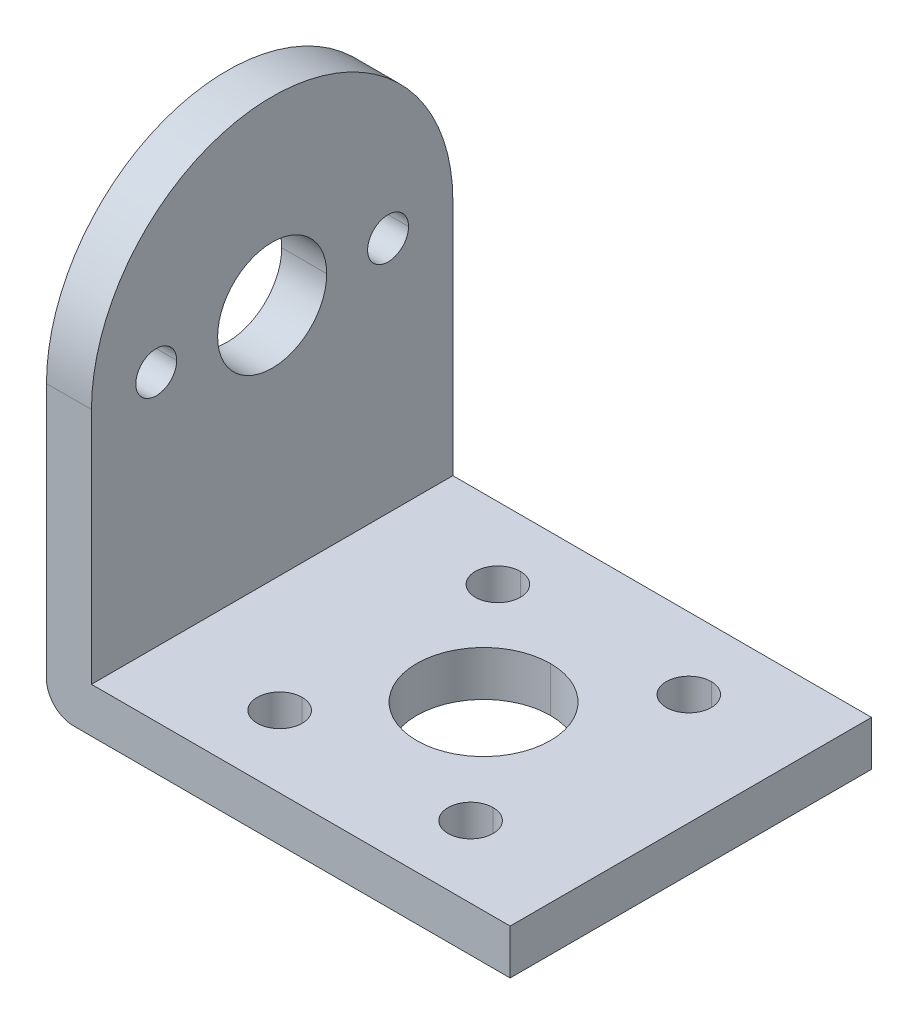
ISO-10303-21;
HEADER;
FILE_DESCRIPTION(('STEP AP214'),'2;1');
FILE_NAME('part.step','',(''),(''),'','','');
FILE_SCHEMA(('AUTOMOTIVE_DESIGN { 1 0 10303 214 1 1 1 1 }'));
ENDSEC;
DATA;
#1=APPLICATION_CONTEXT('core data for automotive mechanical design processes');
#2=APPLICATION_PROTOCOL_DEFINITION('international standard','automotive_design',2000,#1);
#3=PRODUCT_CONTEXT('',#1,'mechanical');
#4=PRODUCT('Part','Part','',(#3));
#5=PRODUCT_RELATED_PRODUCT_CATEGORY('part','',(#4));
#6=PRODUCT_DEFINITION_FORMATION('','',#4);
#7=PRODUCT_DEFINITION_CONTEXT('part definition',#1,'design');
#8=PRODUCT_DEFINITION('design','',#6,#7);
#9=PRODUCT_DEFINITION_SHAPE('','',#8);
#10=(LENGTH_UNIT() NAMED_UNIT(*) SI_UNIT(.MILLI.,.METRE.));
#11=(NAMED_UNIT(*) PLANE_ANGLE_UNIT() SI_UNIT($,.RADIAN.));
#12=(NAMED_UNIT(*) SI_UNIT($,.STERADIAN.) SOLID_ANGLE_UNIT());
#13=UNCERTAINTY_MEASURE_WITH_UNIT(LENGTH_MEASURE(1.E-05),#10,'distance_accuracy_value','');
#14=(GEOMETRIC_REPRESENTATION_CONTEXT(3) GLOBAL_UNCERTAINTY_ASSIGNED_CONTEXT((#13)) GLOBAL_UNIT_ASSIGNED_CONTEXT((#10,
#11,#12)) REPRESENTATION_CONTEXT('',''));
#15=CARTESIAN_POINT('',(0.,0.,0.));
#16=DIRECTION('',(0.,0.,1.));
#17=DIRECTION('',(1.,0.,0.));
#18=AXIS2_PLACEMENT_3D('',#15,#16,#17);
#19=CARTESIAN_POINT('',(0.,0.,-8.5));
#20=DIRECTION('',(-1.,0.,0.));
#21=DIRECTION('',(0.,0.,1.));
#22=AXIS2_PLACEMENT_3D('',#19,#20,#21);
#23=CONICAL_SURFACE('',#22,2.5,0.785398163397443);
#24=DIRECTION('',(-0.707106781186551,0.,-0.707106781186545));
#25=VECTOR('',#24,1.);
#26=CARTESIAN_POINT('',(0.,0.,-11.));
#27=LINE('',#26,#25);
#28=CARTESIAN_POINT('',(1.,0.,-10.));
#29=VERTEX_POINT('',#28);
#30=CARTESIAN_POINT('',(0.,0.,-11.));
#31=VERTEX_POINT('',#30);
#32=EDGE_CURVE('E522',#29,#31,#27,.T.);
#33=ORIENTED_EDGE('',*,*,#32,.F.);
#34=CARTESIAN_POINT('',(1.,0.,-8.5));
#35=DIRECTION('',(-1.,0.,0.));
#36=DIRECTION('',(0.,0.,-1.));
#37=AXIS2_PLACEMENT_3D('',#34,#35,#36);
#38=CIRCLE('',#37,1.5);
#39=CARTESIAN_POINT('',(1.,0.,-7.));
#40=VERTEX_POINT('',#39);
#41=EDGE_CURVE('E310',#40,#29,#38,.T.);
#42=ORIENTED_EDGE('',*,*,#41,.F.);
#43=DIRECTION('',(-0.707106781186551,0.,0.707106781186545));
#44=VECTOR('',#43,1.);
#45=CARTESIAN_POINT('',(0.,0.,-6.));
#46=LINE('',#45,#44);
#47=CARTESIAN_POINT('',(0.,0.,-6.));
#48=VERTEX_POINT('',#47);
#49=EDGE_CURVE('E535',#40,#48,#46,.T.);
#50=ORIENTED_EDGE('',*,*,#49,.T.);
#51=CARTESIAN_POINT('',(0.,0.,-8.5));
#52=DIRECTION('',(1.,0.,0.));
#53=DIRECTION('',(0.,0.,-1.));
#54=AXIS2_PLACEMENT_3D('',#51,#52,#53);
#55=CIRCLE('',#54,2.5);
#56=EDGE_CURVE('E284',#31,#48,#55,.T.);
#57=ORIENTED_EDGE('',*,*,#56,.F.);
#58=EDGE_LOOP('',(#33,#42,#50,#57));
#59=FACE_BOUND('',#58,.T.);
#60=ADVANCED_FACE('F15',(#59),#23,.F.);
#61=CARTESIAN_POINT('',(0.,0.,8.5));
#62=DIRECTION('',(-1.,0.,0.));
#63=DIRECTION('',(0.,0.,1.));
#64=AXIS2_PLACEMENT_3D('',#61,#62,#63);
#65=CONICAL_SURFACE('',#64,2.5,0.785398163397443);
#66=DIRECTION('',(-0.707106781186551,0.,-0.707106781186544));
#67=VECTOR('',#66,1.);
#68=CARTESIAN_POINT('',(0.,0.,6.));
#69=LINE('',#68,#67);
#70=CARTESIAN_POINT('',(1.,0.,7.));
#71=VERTEX_POINT('',#70);
#72=CARTESIAN_POINT('',(0.,0.,6.));
#73=VERTEX_POINT('',#72);
#74=EDGE_CURVE('E545',#71,#73,#69,.T.);
#75=ORIENTED_EDGE('',*,*,#74,.F.);
#76=CARTESIAN_POINT('',(1.,0.,8.5));
#77=DIRECTION('',(-1.,0.,0.));
#78=DIRECTION('',(0.,0.,-1.));
#79=AXIS2_PLACEMENT_3D('',#76,#77,#78);
#80=CIRCLE('',#79,1.5);
#81=CARTESIAN_POINT('',(1.,0.,10.));
#82=VERTEX_POINT('',#81);
#83=EDGE_CURVE('E307',#82,#71,#80,.T.);
#84=ORIENTED_EDGE('',*,*,#83,.F.);
#85=DIRECTION('',(-0.707106781186551,0.,0.707106781186544));
#86=VECTOR('',#85,1.);
#87=CARTESIAN_POINT('',(0.,0.,11.));
#88=LINE('',#87,#86);
#89=CARTESIAN_POINT('',(0.,0.,11.));
#90=VERTEX_POINT('',#89);
#91=EDGE_CURVE('E277',#82,#90,#88,.T.);
#92=ORIENTED_EDGE('',*,*,#91,.T.);
#93=CARTESIAN_POINT('',(0.,0.,8.5));
#94=DIRECTION('',(1.,0.,0.));
#95=DIRECTION('',(0.,0.,-1.));
#96=AXIS2_PLACEMENT_3D('',#93,#94,#95);
#97=CIRCLE('',#96,2.5);
#98=EDGE_CURVE('E288',#73,#90,#97,.T.);
#99=ORIENTED_EDGE('',*,*,#98,.F.);
#100=EDGE_LOOP('',(#75,#84,#92,#99));
#101=FACE_BOUND('',#100,.T.);
#102=ADVANCED_FACE('F513',(#101),#65,.F.);
#103=CARTESIAN_POINT('',(25.85,-17.45,-8.));
#104=DIRECTION('',(0.,-1.,0.));
#105=DIRECTION('',(0.,0.,-1.));
#106=AXIS2_PLACEMENT_3D('',#103,#104,#105);
#107=CYLINDRICAL_SURFACE('',#106,1.65);
#108=DIRECTION('',(0.,-1.,0.));
#109=VECTOR('',#108,1.);
#110=CARTESIAN_POINT('',(25.85,-17.45,-6.35));
#111=LINE('',#110,#109);
#112=CARTESIAN_POINT('',(25.85,-17.45,-6.35));
#113=VERTEX_POINT('',#112);
#114=CARTESIAN_POINT('',(25.85,-20.75,-6.35));
#115=VERTEX_POINT('',#114);
#116=EDGE_CURVE('E265',#113,#115,#111,.T.);
#117=ORIENTED_EDGE('',*,*,#116,.F.);
#118=CARTESIAN_POINT('',(25.85,-17.45,-8.));
#119=DIRECTION('',(0.,-1.,0.));
#120=DIRECTION('',(0.,0.,-1.));
#121=AXIS2_PLACEMENT_3D('',#118,#119,#120);
#122=CIRCLE('',#121,1.65);
#123=CARTESIAN_POINT('',(25.85,-17.45,-9.65));
#124=VERTEX_POINT('',#123);
#125=EDGE_CURVE('E257',#124,#113,#122,.T.);
#126=ORIENTED_EDGE('',*,*,#125,.F.);
#127=DIRECTION('',(0.,-1.,0.));
#128=VECTOR('',#127,1.);
#129=CARTESIAN_POINT('',(25.85,-17.45,-9.65));
#130=LINE('',#129,#128);
#131=CARTESIAN_POINT('',(25.85,-20.75,-9.65));
#132=VERTEX_POINT('',#131);
#133=EDGE_CURVE('E255',#124,#132,#130,.T.);
#134=ORIENTED_EDGE('',*,*,#133,.T.);
#135=CARTESIAN_POINT('',(25.85,-20.75,-8.));
#136=DIRECTION('',(0.,-1.,0.));
#137=DIRECTION('',(0.,0.,-1.));
#138=AXIS2_PLACEMENT_3D('',#135,#136,#137);
#139=CIRCLE('',#138,1.65);
#140=EDGE_CURVE('E241',#132,#115,#139,.T.);
#141=ORIENTED_EDGE('',*,*,#140,.T.);
#142=EDGE_LOOP('',(#117,#126,#134,#141));
#143=FACE_BOUND('',#142,.T.);
#144=ADVANCED_FACE('F256',(#143),#107,.F.);
#145=CARTESIAN_POINT('',(11.85,-17.45,8.));
#146=DIRECTION('',(0.,-1.,0.));
#147=DIRECTION('',(0.,0.,-1.));
#148=AXIS2_PLACEMENT_3D('',#145,#146,#147);
#149=CYLINDRICAL_SURFACE('',#148,1.65);
#150=DIRECTION('',(0.,-1.,0.));
#151=VECTOR('',#150,1.);
#152=CARTESIAN_POINT('',(11.85,-17.45,9.65));
#153=LINE('',#152,#151);
#154=CARTESIAN_POINT('',(11.85,-17.45,9.65));
#155=VERTEX_POINT('',#154);
#156=CARTESIAN_POINT('',(11.85,-20.75,9.65));
#157=VERTEX_POINT('',#156);
#158=EDGE_CURVE('E292',#155,#157,#153,.T.);
#159=ORIENTED_EDGE('',*,*,#158,.F.);
#160=CARTESIAN_POINT('',(11.85,-17.45,8.));
#161=DIRECTION('',(0.,-1.,0.));
#162=DIRECTION('',(0.,0.,-1.));
#163=AXIS2_PLACEMENT_3D('',#160,#161,#162);
#164=CIRCLE('',#163,1.65);
#165=CARTESIAN_POINT('',(11.85,-17.45,6.35));
#166=VERTEX_POINT('',#165);
#167=EDGE_CURVE('E394',#166,#155,#164,.T.);
#168=ORIENTED_EDGE('',*,*,#167,.F.);
#169=DIRECTION('',(0.,-1.,0.));
#170=VECTOR('',#169,1.);
#171=CARTESIAN_POINT('',(11.85,-17.45,6.35));
#172=LINE('',#171,#170);
#173=CARTESIAN_POINT('',(11.85,-20.75,6.35));
#174=VERTEX_POINT('',#173);
#175=EDGE_CURVE('E279',#166,#174,#172,.T.);
#176=ORIENTED_EDGE('',*,*,#175,.T.);
#177=CARTESIAN_POINT('',(11.85,-20.75,8.));
#178=DIRECTION('',(0.,-1.,0.));
#179=DIRECTION('',(0.,0.,-1.));
#180=AXIS2_PLACEMENT_3D('',#177,#178,#179);
#181=CIRCLE('',#180,1.65);
#182=EDGE_CURVE('E251',#174,#157,#181,.T.);
#183=ORIENTED_EDGE('',*,*,#182,.T.);
#184=EDGE_LOOP('',(#159,#168,#176,#183));
#185=FACE_BOUND('',#184,.T.);
#186=ADVANCED_FACE('F489',(#185),#149,.F.);
#187=CARTESIAN_POINT('',(11.85,-17.45,-8.));
#188=DIRECTION('',(0.,-1.,0.));
#189=DIRECTION('',(0.,0.,-1.));
#190=AXIS2_PLACEMENT_3D('',#187,#188,#189);
#191=CYLINDRICAL_SURFACE('',#190,1.65);
#192=DIRECTION('',(0.,-1.,0.));
#193=VECTOR('',#192,1.);
#194=CARTESIAN_POINT('',(11.85,-17.45,-6.35));
#195=LINE('',#194,#193);
#196=CARTESIAN_POINT('',(11.85,-17.45,-6.35));
#197=VERTEX_POINT('',#196);
#198=CARTESIAN_POINT('',(11.85,-20.75,-6.35));
#199=VERTEX_POINT('',#198);
#200=EDGE_CURVE('E306',#197,#199,#195,.T.);
#201=ORIENTED_EDGE('',*,*,#200,.F.);
#202=CARTESIAN_POINT('',(11.85,-17.45,-8.));
#203=DIRECTION('',(0.,-1.,0.));
#204=DIRECTION('',(0.,0.,-1.));
#205=AXIS2_PLACEMENT_3D('',#202,#203,#204);
#206=CIRCLE('',#205,1.65);
#207=CARTESIAN_POINT('',(11.85,-17.45,-9.65));
#208=VERTEX_POINT('',#207);
#209=EDGE_CURVE('E399',#208,#197,#206,.T.);
#210=ORIENTED_EDGE('',*,*,#209,.F.);
#211=DIRECTION('',(0.,-1.,0.));
#212=VECTOR('',#211,1.);
#213=CARTESIAN_POINT('',(11.85,-17.45,-9.65));
#214=LINE('',#213,#212);
#215=CARTESIAN_POINT('',(11.85,-20.75,-9.65));
#216=VERTEX_POINT('',#215);
#217=EDGE_CURVE('E315',#208,#216,#214,.T.);
#218=ORIENTED_EDGE('',*,*,#217,.T.);
#219=CARTESIAN_POINT('',(11.85,-20.75,-8.));
#220=DIRECTION('',(0.,-1.,0.));
#221=DIRECTION('',(0.,0.,-1.));
#222=AXIS2_PLACEMENT_3D('',#219,#220,#221);
#223=CIRCLE('',#222,1.65);
#224=EDGE_CURVE('E460',#216,#199,#223,.T.);
#225=ORIENTED_EDGE('',*,*,#224,.T.);
#226=EDGE_LOOP('',(#201,#210,#218,#225));
#227=FACE_BOUND('',#226,.T.);
#228=ADVANCED_FACE('F641',(#227),#191,.F.);
#229=CARTESIAN_POINT('',(25.85,-17.45,8.));
#230=DIRECTION('',(0.,-1.,0.));
#231=DIRECTION('',(0.,0.,-1.));
#232=AXIS2_PLACEMENT_3D('',#229,#230,#231);
#233=CYLINDRICAL_SURFACE('',#232,1.65);
#234=DIRECTION('',(0.,-1.,0.));
#235=VECTOR('',#234,1.);
#236=CARTESIAN_POINT('',(25.85,-17.45,9.65));
#237=LINE('',#236,#235);
#238=CARTESIAN_POINT('',(25.85,-17.45,9.65));
#239=VERTEX_POINT('',#238);
#240=CARTESIAN_POINT('',(25.85,-20.75,9.65));
#241=VERTEX_POINT('',#240);
#242=EDGE_CURVE('E341',#239,#241,#237,.T.);
#243=ORIENTED_EDGE('',*,*,#242,.F.);
#244=CARTESIAN_POINT('',(25.85,-17.45,8.));
#245=DIRECTION('',(0.,-1.,0.));
#246=DIRECTION('',(0.,0.,-1.));
#247=AXIS2_PLACEMENT_3D('',#244,#245,#246);
#248=CIRCLE('',#247,1.65);
#249=CARTESIAN_POINT('',(25.85,-17.45,6.35));
#250=VERTEX_POINT('',#249);
#251=EDGE_CURVE('E18',#250,#239,#248,.T.);
#252=ORIENTED_EDGE('',*,*,#251,.F.);
#253=DIRECTION('',(0.,-1.,0.));
#254=VECTOR('',#253,1.);
#255=CARTESIAN_POINT('',(25.85,-17.45,6.35));
#256=LINE('',#255,#254);
#257=CARTESIAN_POINT('',(25.85,-20.75,6.35));
#258=VERTEX_POINT('',#257);
#259=EDGE_CURVE('E337',#250,#258,#256,.T.);
#260=ORIENTED_EDGE('',*,*,#259,.T.);
#261=CARTESIAN_POINT('',(25.85,-20.75,8.));
#262=DIRECTION('',(0.,-1.,0.));
#263=DIRECTION('',(0.,0.,-1.));
#264=AXIS2_PLACEMENT_3D('',#261,#262,#263);
#265=CIRCLE('',#264,1.65);
#266=EDGE_CURVE('E463',#258,#241,#265,.T.);
#267=ORIENTED_EDGE('',*,*,#266,.T.);
#268=EDGE_LOOP('',(#243,#252,#260,#267));
#269=FACE_BOUND('',#268,.T.);
#270=ADVANCED_FACE('F669',(#269),#233,.F.);
#271=CARTESIAN_POINT('',(18.8,-17.45,0.));
#272=DIRECTION('',(0.,-1.,0.));
#273=DIRECTION('',(0.,0.,-1.));
#274=AXIS2_PLACEMENT_3D('',#271,#272,#273);
#275=CYLINDRICAL_SURFACE('',#274,4.9);
#276=DIRECTION('',(0.,-1.,0.));
#277=VECTOR('',#276,1.);
#278=CARTESIAN_POINT('',(18.8,-17.45,4.9));
#279=LINE('',#278,#277);
#280=CARTESIAN_POINT('',(18.8,-17.45,4.9));
#281=VERTEX_POINT('',#280);
#282=CARTESIAN_POINT('',(18.8,-20.75,4.9));
#283=VERTEX_POINT('',#282);
#284=EDGE_CURVE('E336',#281,#283,#279,.T.);
#285=ORIENTED_EDGE('',*,*,#284,.F.);
#286=CARTESIAN_POINT('',(18.8,-17.45,0.));
#287=DIRECTION('',(0.,-1.,0.));
#288=DIRECTION('',(0.,0.,-1.));
#289=AXIS2_PLACEMENT_3D('',#286,#287,#288);
#290=CIRCLE('',#289,4.9);
#291=CARTESIAN_POINT('',(18.8,-17.45,-4.9));
#292=VERTEX_POINT('',#291);
#293=EDGE_CURVE('E9',#292,#281,#290,.T.);
#294=ORIENTED_EDGE('',*,*,#293,.F.);
#295=DIRECTION('',(0.,-1.,0.));
#296=VECTOR('',#295,1.);
#297=CARTESIAN_POINT('',(18.8,-17.45,-4.9));
#298=LINE('',#297,#296);
#299=CARTESIAN_POINT('',(18.8,-20.75,-4.9));
#300=VERTEX_POINT('',#299);
#301=EDGE_CURVE('E331',#292,#300,#298,.T.);
#302=ORIENTED_EDGE('',*,*,#301,.T.);
#303=CARTESIAN_POINT('',(18.8,-20.75,0.));
#304=DIRECTION('',(0.,-1.,0.));
#305=DIRECTION('',(0.,0.,-1.));
#306=AXIS2_PLACEMENT_3D('',#303,#304,#305);
#307=CIRCLE('',#306,4.9);
#308=EDGE_CURVE('E466',#300,#283,#307,.T.);
#309=ORIENTED_EDGE('',*,*,#308,.T.);
#310=EDGE_LOOP('',(#285,#294,#302,#309));
#311=FACE_BOUND('',#310,.T.);
#312=ADVANCED_FACE('F666',(#311),#275,.F.);
#313=CARTESIAN_POINT('',(2.,-18.75,13.25));
#314=DIRECTION('',(0.,0.,-1.));
#315=DIRECTION('',(0.,1.,0.));
#316=AXIS2_PLACEMENT_3D('',#313,#314,#315);
#317=CYLINDRICAL_SURFACE('',#316,2.);
#318=CARTESIAN_POINT('',(2.,-18.75,13.25));
#319=DIRECTION('',(0.,0.,1.));
#320=DIRECTION('',(0.,1.,0.));
#321=AXIS2_PLACEMENT_3D('',#318,#319,#320);
#322=CIRCLE('',#321,2.);
#323=CARTESIAN_POINT('',(0.,-18.75,13.25));
#324=VERTEX_POINT('',#323);
#325=CARTESIAN_POINT('',(2.,-20.75,13.25));
#326=VERTEX_POINT('',#325);
#327=EDGE_CURVE('E446',#324,#326,#322,.T.);
#328=ORIENTED_EDGE('',*,*,#327,.F.);
#329=DIRECTION('',(0.,0.,1.));
#330=VECTOR('',#329,1.);
#331=CARTESIAN_POINT('',(0.,-18.75,0.));
#332=LINE('',#331,#330);
#333=CARTESIAN_POINT('',(0.,-18.75,-13.25));
#334=VERTEX_POINT('',#333);
#335=EDGE_CURVE('E433',#334,#324,#332,.T.);
#336=ORIENTED_EDGE('',*,*,#335,.F.);
#337=CARTESIAN_POINT('',(2.,-18.75,-13.25));
#338=DIRECTION('',(0.,0.,-1.));
#339=DIRECTION('',(0.,-1.,0.));
#340=AXIS2_PLACEMENT_3D('',#337,#338,#339);
#341=CIRCLE('',#340,2.);
#342=CARTESIAN_POINT('',(2.,-20.75,-13.25));
#343=VERTEX_POINT('',#342);
#344=EDGE_CURVE('E469',#343,#334,#341,.T.);
#345=ORIENTED_EDGE('',*,*,#344,.F.);
#346=DIRECTION('',(0.,0.,-1.));
#347=VECTOR('',#346,1.);
#348=CARTESIAN_POINT('',(2.,-20.75,13.25));
#349=LINE('',#348,#347);
#350=EDGE_CURVE('E381',#326,#343,#349,.T.);
#351=ORIENTED_EDGE('',*,*,#350,.F.);
#352=EDGE_LOOP('',(#328,#336,#345,#351));
#353=FACE_BOUND('',#352,.T.);
#354=ADVANCED_FACE('F613',(#353),#317,.T.);
#355=CARTESIAN_POINT('',(34.,0.,0.));
#356=DIRECTION('',(1.,0.,0.));
#357=DIRECTION('',(0.,1.,0.));
#358=AXIS2_PLACEMENT_3D('',#355,#356,#357);
#359=PLANE('',#358);
#360=DIRECTION('',(0.,-1.,0.));
#361=VECTOR('',#360,1.);
#362=CARTESIAN_POINT('',(34.,-17.45,13.25));
#363=LINE('',#362,#361);
#364=CARTESIAN_POINT('',(34.,-17.45,13.25));
#365=VERTEX_POINT('',#364);
#366=CARTESIAN_POINT('',(34.,-20.75,13.25));
#367=VERTEX_POINT('',#366);
#368=EDGE_CURVE('E346',#365,#367,#363,.T.);
#369=ORIENTED_EDGE('',*,*,#368,.T.);
#370=DIRECTION('',(0.,0.,-1.));
#371=VECTOR('',#370,1.);
#372=CARTESIAN_POINT('',(34.,-20.75,13.25));
#373=LINE('',#372,#371);
#374=CARTESIAN_POINT('',(34.,-20.75,-13.25));
#375=VERTEX_POINT('',#374);
#376=EDGE_CURVE('E252',#367,#375,#373,.T.);
#377=ORIENTED_EDGE('',*,*,#376,.T.);
#378=DIRECTION('',(0.,1.,0.));
#379=VECTOR('',#378,1.);
#380=CARTESIAN_POINT('',(34.,-17.45,-13.25));
#381=LINE('',#380,#379);
#382=CARTESIAN_POINT('',(34.,-17.45,-13.25));
#383=VERTEX_POINT('',#382);
#384=EDGE_CURVE('E47',#375,#383,#381,.T.);
#385=ORIENTED_EDGE('',*,*,#384,.T.);
#386=DIRECTION('',(0.,0.,1.));
#387=VECTOR('',#386,1.);
#388=CARTESIAN_POINT('',(34.,-17.45,13.25));
#389=LINE('',#388,#387);
#390=EDGE_CURVE('E37',#383,#365,#389,.T.);
#391=ORIENTED_EDGE('',*,*,#390,.T.);
#392=EDGE_LOOP('',(#369,#377,#385,#391));
#393=FACE_BOUND('',#392,.T.);
#394=ADVANCED_FACE('F609',(#393),#359,.T.);
#395=CARTESIAN_POINT('',(34.,-17.45,13.25));
#396=DIRECTION('',(0.,-1.,0.));
#397=DIRECTION('',(0.,0.,-1.));
#398=AXIS2_PLACEMENT_3D('',#395,#396,#397);
#399=PLANE('',#398);
#400=ORIENTED_EDGE('',*,*,#293,.T.);
#401=CARTESIAN_POINT('',(18.8,-17.45,0.));
#402=DIRECTION('',(0.,-1.,0.));
#403=DIRECTION('',(0.,0.,-1.));
#404=AXIS2_PLACEMENT_3D('',#401,#402,#403);
#405=CIRCLE('',#404,4.9);
#406=EDGE_CURVE('E332',#281,#292,#405,.T.);
#407=ORIENTED_EDGE('',*,*,#406,.T.);
#408=EDGE_LOOP('',(#400,#407));
#409=FACE_BOUND('',#408,.T.);
#410=ORIENTED_EDGE('',*,*,#251,.T.);
#411=CARTESIAN_POINT('',(25.85,-17.45,8.));
#412=DIRECTION('',(0.,-1.,0.));
#413=DIRECTION('',(0.,0.,-1.));
#414=AXIS2_PLACEMENT_3D('',#411,#412,#413);
#415=CIRCLE('',#414,1.65);
#416=EDGE_CURVE('E319',#239,#250,#415,.T.);
#417=ORIENTED_EDGE('',*,*,#416,.T.);
#418=EDGE_LOOP('',(#410,#417));
#419=FACE_BOUND('',#418,.T.);
#420=ORIENTED_EDGE('',*,*,#209,.T.);
#421=CARTESIAN_POINT('',(11.85,-17.45,-8.));
#422=DIRECTION('',(0.,-1.,0.));
#423=DIRECTION('',(0.,0.,-1.));
#424=AXIS2_PLACEMENT_3D('',#421,#422,#423);
#425=CIRCLE('',#424,1.65);
#426=EDGE_CURVE('E282',#197,#208,#425,.T.);
#427=ORIENTED_EDGE('',*,*,#426,.T.);
#428=EDGE_LOOP('',(#420,#427));
#429=FACE_BOUND('',#428,.T.);
#430=ORIENTED_EDGE('',*,*,#167,.T.);
#431=CARTESIAN_POINT('',(11.85,-17.45,8.));
#432=DIRECTION('',(0.,-1.,0.));
#433=DIRECTION('',(0.,0.,-1.));
#434=AXIS2_PLACEMENT_3D('',#431,#432,#433);
#435=CIRCLE('',#434,1.65);
#436=EDGE_CURVE('E262',#155,#166,#435,.T.);
#437=ORIENTED_EDGE('',*,*,#436,.T.);
#438=EDGE_LOOP('',(#430,#437));
#439=FACE_BOUND('',#438,.T.);
#440=ORIENTED_EDGE('',*,*,#125,.T.);
#441=CARTESIAN_POINT('',(25.85,-17.45,-8.));
#442=DIRECTION('',(0.,-1.,0.));
#443=DIRECTION('',(0.,0.,-1.));
#444=AXIS2_PLACEMENT_3D('',#441,#442,#443);
#445=CIRCLE('',#444,1.65);
#446=EDGE_CURVE('E273',#113,#124,#445,.T.);
#447=ORIENTED_EDGE('',*,*,#446,.T.);
#448=EDGE_LOOP('',(#440,#447));
#449=FACE_BOUND('',#448,.T.);
#450=DIRECTION('',(0.,0.,1.));
#451=VECTOR('',#450,1.);
#452=CARTESIAN_POINT('',(3.3,-17.45,13.25));
#453=LINE('',#452,#451);
#454=CARTESIAN_POINT('',(3.3,-17.45,-13.25));
#455=VERTEX_POINT('',#454);
#456=CARTESIAN_POINT('',(3.3,-17.45,13.25));
#457=VERTEX_POINT('',#456);
#458=EDGE_CURVE('E320',#455,#457,#453,.T.);
#459=ORIENTED_EDGE('',*,*,#458,.T.);
#460=DIRECTION('',(-1.,0.,0.));
#461=VECTOR('',#460,1.);
#462=CARTESIAN_POINT('',(34.,-17.45,13.25));
#463=LINE('',#462,#461);
#464=EDGE_CURVE('E350',#365,#457,#463,.T.);
#465=ORIENTED_EDGE('',*,*,#464,.F.);
#466=ORIENTED_EDGE('',*,*,#390,.F.);
#467=DIRECTION('',(-1.,0.,0.));
#468=VECTOR('',#467,1.);
#469=CARTESIAN_POINT('',(34.,-17.45,-13.25));
#470=LINE('',#469,#468);
#471=EDGE_CURVE('E472',#383,#455,#470,.T.);
#472=ORIENTED_EDGE('',*,*,#471,.T.);
#473=EDGE_LOOP('',(#459,#465,#466,#472));
#474=FACE_BOUND('',#473,.T.);
#475=ADVANCED_FACE('F484',(#409,#419,#429,#439,#449,#474),#399,.F.);
#476=CARTESIAN_POINT('',(3.3,0.,-8.5));
#477=DIRECTION('',(-1.,0.,0.));
#478=DIRECTION('',(0.,0.,1.));
#479=AXIS2_PLACEMENT_3D('',#476,#477,#478);
#480=CYLINDRICAL_SURFACE('',#479,1.5);
#481=DIRECTION('',(-1.,0.,0.));
#482=VECTOR('',#481,1.);
#483=CARTESIAN_POINT('',(3.3,0.,-10.));
#484=LINE('',#483,#482);
#485=CARTESIAN_POINT('',(3.3,0.,-10.));
#486=VERTEX_POINT('',#485);
#487=EDGE_CURVE('E330',#486,#29,#484,.T.);
#488=ORIENTED_EDGE('',*,*,#487,.F.);
#489=CARTESIAN_POINT('',(3.3,0.,-8.5));
#490=DIRECTION('',(1.,0.,0.));
#491=DIRECTION('',(0.,0.,-1.));
#492=AXIS2_PLACEMENT_3D('',#489,#490,#491);
#493=CIRCLE('',#492,1.5);
#494=CARTESIAN_POINT('',(3.3,0.,-7.));
#495=VERTEX_POINT('',#494);
#496=EDGE_CURVE('E426',#486,#495,#493,.T.);
#497=ORIENTED_EDGE('',*,*,#496,.T.);
#498=DIRECTION('',(-1.,0.,0.));
#499=VECTOR('',#498,1.);
#500=CARTESIAN_POINT('',(3.3,0.,-7.));
#501=LINE('',#500,#499);
#502=EDGE_CURVE('E377',#495,#40,#501,.T.);
#503=ORIENTED_EDGE('',*,*,#502,.T.);
#504=ORIENTED_EDGE('',*,*,#41,.T.);
#505=EDGE_LOOP('',(#488,#497,#503,#504));
#506=FACE_BOUND('',#505,.T.);
#507=ADVANCED_FACE('F653',(#506),#480,.F.);
#508=CARTESIAN_POINT('',(3.3,0.,8.5));
#509=DIRECTION('',(-1.,0.,0.));
#510=DIRECTION('',(0.,0.,1.));
#511=AXIS2_PLACEMENT_3D('',#508,#509,#510);
#512=CYLINDRICAL_SURFACE('',#511,1.5);
#513=DIRECTION('',(-1.,0.,0.));
#514=VECTOR('',#513,1.);
#515=CARTESIAN_POINT('',(3.3,0.,7.));
#516=LINE('',#515,#514);
#517=CARTESIAN_POINT('',(3.3,0.,7.));
#518=VERTEX_POINT('',#517);
#519=EDGE_CURVE('E363',#518,#71,#516,.T.);
#520=ORIENTED_EDGE('',*,*,#519,.F.);
#521=CARTESIAN_POINT('',(3.3,0.,8.5));
#522=DIRECTION('',(1.,0.,0.));
#523=DIRECTION('',(0.,0.,-1.));
#524=AXIS2_PLACEMENT_3D('',#521,#522,#523);
#525=CIRCLE('',#524,1.5);
#526=CARTESIAN_POINT('',(3.3,0.,10.));
#527=VERTEX_POINT('',#526);
#528=EDGE_CURVE('E409',#518,#527,#525,.T.);
#529=ORIENTED_EDGE('',*,*,#528,.T.);
#530=DIRECTION('',(-1.,0.,0.));
#531=VECTOR('',#530,1.);
#532=CARTESIAN_POINT('',(3.3,0.,10.));
#533=LINE('',#532,#531);
#534=EDGE_CURVE('E358',#527,#82,#533,.T.);
#535=ORIENTED_EDGE('',*,*,#534,.T.);
#536=ORIENTED_EDGE('',*,*,#83,.T.);
#537=EDGE_LOOP('',(#520,#529,#535,#536));
#538=FACE_BOUND('',#537,.T.);
#539=ADVANCED_FACE('F590',(#538),#512,.F.);
#540=CARTESIAN_POINT('',(3.3,0.,0.));
#541=DIRECTION('',(-1.,0.,0.));
#542=DIRECTION('',(0.,0.,1.));
#543=AXIS2_PLACEMENT_3D('',#540,#541,#542);
#544=CYLINDRICAL_SURFACE('',#543,4.);
#545=DIRECTION('',(-1.,0.,0.));
#546=VECTOR('',#545,1.);
#547=CARTESIAN_POINT('',(3.3,0.,-4.));
#548=LINE('',#547,#546);
#549=CARTESIAN_POINT('',(3.3,0.,-4.));
#550=VERTEX_POINT('',#549);
#551=CARTESIAN_POINT('',(0.,0.,-4.));
#552=VERTEX_POINT('',#551);
#553=EDGE_CURVE('E398',#550,#552,#548,.T.);
#554=ORIENTED_EDGE('',*,*,#553,.F.);
#555=CARTESIAN_POINT('',(3.3,0.,0.));
#556=DIRECTION('',(1.,0.,0.));
#557=DIRECTION('',(0.,0.,-1.));
#558=AXIS2_PLACEMENT_3D('',#555,#556,#557);
#559=CIRCLE('',#558,4.);
#560=CARTESIAN_POINT('',(3.3,0.,4.));
#561=VERTEX_POINT('',#560);
#562=EDGE_CURVE('E412',#550,#561,#559,.T.);
#563=ORIENTED_EDGE('',*,*,#562,.T.);
#564=DIRECTION('',(-1.,0.,0.));
#565=VECTOR('',#564,1.);
#566=CARTESIAN_POINT('',(3.3,0.,4.));
#567=LINE('',#566,#565);
#568=CARTESIAN_POINT('',(0.,0.,4.));
#569=VERTEX_POINT('',#568);
#570=EDGE_CURVE('E325',#561,#569,#567,.T.);
#571=ORIENTED_EDGE('',*,*,#570,.T.);
#572=CARTESIAN_POINT('',(0.,0.,0.));
#573=DIRECTION('',(1.,0.,0.));
#574=DIRECTION('',(0.,0.,-1.));
#575=AXIS2_PLACEMENT_3D('',#572,#573,#574);
#576=CIRCLE('',#575,4.);
#577=EDGE_CURVE('E287',#552,#569,#576,.T.);
#578=ORIENTED_EDGE('',*,*,#577,.F.);
#579=EDGE_LOOP('',(#554,#563,#571,#578));
#580=FACE_BOUND('',#579,.T.);
#581=ADVANCED_FACE('F507',(#580),#544,.F.);
#582=CARTESIAN_POINT('',(3.3,0.,-13.25));
#583=DIRECTION('',(0.,0.,1.));
#584=DIRECTION('',(0.,-1.,0.));
#585=AXIS2_PLACEMENT_3D('',#582,#583,#584);
#586=PLANE('',#585);
#587=DIRECTION('',(-1.,0.,0.));
#588=VECTOR('',#587,1.);
#589=CARTESIAN_POINT('',(3.3,-20.75,-13.25));
#590=LINE('',#589,#588);
#591=EDGE_CURVE('E378',#375,#343,#590,.T.);
#592=ORIENTED_EDGE('',*,*,#591,.T.);
#593=ORIENTED_EDGE('',*,*,#344,.T.);
#594=DIRECTION('',(0.,1.,0.));
#595=VECTOR('',#594,1.);
#596=CARTESIAN_POINT('',(0.,0.,-13.25));
#597=LINE('',#596,#595);
#598=CARTESIAN_POINT('',(0.,0.,-13.25));
#599=VERTEX_POINT('',#598);
#600=EDGE_CURVE('E429',#334,#599,#597,.T.);
#601=ORIENTED_EDGE('',*,*,#600,.T.);
#602=DIRECTION('',(-1.,0.,0.));
#603=VECTOR('',#602,1.);
#604=CARTESIAN_POINT('',(3.3,0.,-13.25));
#605=LINE('',#604,#603);
#606=CARTESIAN_POINT('',(3.3,0.,-13.25));
#607=VERTEX_POINT('',#606);
#608=EDGE_CURVE('E296',#607,#599,#605,.T.);
#609=ORIENTED_EDGE('',*,*,#608,.F.);
#610=DIRECTION('',(0.,1.,0.));
#611=VECTOR('',#610,1.);
#612=CARTESIAN_POINT('',(3.3,0.,-13.25));
#613=LINE('',#612,#611);
#614=EDGE_CURVE('E324',#455,#607,#613,.T.);
#615=ORIENTED_EDGE('',*,*,#614,.F.);
#616=ORIENTED_EDGE('',*,*,#471,.F.);
#617=ORIENTED_EDGE('',*,*,#384,.F.);
#618=EDGE_LOOP('',(#592,#593,#601,#609,#615,#616,#617));
#619=FACE_BOUND('',#618,.T.);
#620=ADVANCED_FACE('F496',(#619),#586,.F.);
#621=CARTESIAN_POINT('',(3.3,-20.75,13.25));
#622=DIRECTION('',(0.,1.,0.));
#623=DIRECTION('',(0.,0.,-1.));
#624=AXIS2_PLACEMENT_3D('',#621,#622,#623);
#625=PLANE('',#624);
#626=ORIENTED_EDGE('',*,*,#308,.F.);
#627=CARTESIAN_POINT('',(18.8,-20.75,0.));
#628=DIRECTION('',(0.,-1.,0.));
#629=DIRECTION('',(0.,0.,-1.));
#630=AXIS2_PLACEMENT_3D('',#627,#628,#629);
#631=CIRCLE('',#630,4.9);
#632=EDGE_CURVE('E367',#283,#300,#631,.T.);
#633=ORIENTED_EDGE('',*,*,#632,.F.);
#634=EDGE_LOOP('',(#626,#633));
#635=FACE_BOUND('',#634,.T.);
#636=ORIENTED_EDGE('',*,*,#266,.F.);
#637=CARTESIAN_POINT('',(25.85,-20.75,8.));
#638=DIRECTION('',(0.,-1.,0.));
#639=DIRECTION('',(0.,0.,-1.));
#640=AXIS2_PLACEMENT_3D('',#637,#638,#639);
#641=CIRCLE('',#640,1.65);
#642=EDGE_CURVE('E345',#241,#258,#641,.T.);
#643=ORIENTED_EDGE('',*,*,#642,.F.);
#644=EDGE_LOOP('',(#636,#643));
#645=FACE_BOUND('',#644,.T.);
#646=ORIENTED_EDGE('',*,*,#224,.F.);
#647=CARTESIAN_POINT('',(11.85,-20.75,-8.));
#648=DIRECTION('',(0.,-1.,0.));
#649=DIRECTION('',(0.,0.,-1.));
#650=AXIS2_PLACEMENT_3D('',#647,#648,#649);
#651=CIRCLE('',#650,1.65);
#652=EDGE_CURVE('E314',#199,#216,#651,.T.);
#653=ORIENTED_EDGE('',*,*,#652,.F.);
#654=EDGE_LOOP('',(#646,#653));
#655=FACE_BOUND('',#654,.T.);
#656=ORIENTED_EDGE('',*,*,#182,.F.);
#657=CARTESIAN_POINT('',(11.85,-20.75,8.));
#658=DIRECTION('',(0.,-1.,0.));
#659=DIRECTION('',(0.,0.,-1.));
#660=AXIS2_PLACEMENT_3D('',#657,#658,#659);
#661=CIRCLE('',#660,1.65);
#662=EDGE_CURVE('E283',#157,#174,#661,.T.);
#663=ORIENTED_EDGE('',*,*,#662,.F.);
#664=EDGE_LOOP('',(#656,#663));
#665=FACE_BOUND('',#664,.T.);
#666=ORIENTED_EDGE('',*,*,#140,.F.);
#667=CARTESIAN_POINT('',(25.85,-20.75,-8.));
#668=DIRECTION('',(0.,-1.,0.));
#669=DIRECTION('',(0.,0.,-1.));
#670=AXIS2_PLACEMENT_3D('',#667,#668,#669);
#671=CIRCLE('',#670,1.65);
#672=EDGE_CURVE('E246',#115,#132,#671,.T.);
#673=ORIENTED_EDGE('',*,*,#672,.F.);
#674=EDGE_LOOP('',(#666,#673));
#675=FACE_BOUND('',#674,.T.);
#676=DIRECTION('',(-1.,0.,0.));
#677=VECTOR('',#676,1.);
#678=CARTESIAN_POINT('',(3.3,-20.75,13.25));
#679=LINE('',#678,#677);
#680=EDGE_CURVE('E351',#367,#326,#679,.T.);
#681=ORIENTED_EDGE('',*,*,#680,.T.);
#682=ORIENTED_EDGE('',*,*,#350,.T.);
#683=ORIENTED_EDGE('',*,*,#591,.F.);
#684=ORIENTED_EDGE('',*,*,#376,.F.);
#685=EDGE_LOOP('',(#681,#682,#683,#684));
#686=FACE_BOUND('',#685,.T.);
#687=ADVANCED_FACE('F243',(#635,#645,#655,#665,#675,#686),#625,.F.);
#688=CARTESIAN_POINT('',(3.3,-20.75,13.25));
#689=DIRECTION('',(0.,0.,-1.));
#690=DIRECTION('',(-1.,0.,0.));
#691=AXIS2_PLACEMENT_3D('',#688,#689,#690);
#692=PLANE('',#691);
#693=DIRECTION('',(0.,-1.,0.));
#694=VECTOR('',#693,1.);
#695=CARTESIAN_POINT('',(0.,-20.75,13.25));
#696=LINE('',#695,#694);
#697=CARTESIAN_POINT('',(0.,0.,13.25));
#698=VERTEX_POINT('',#697);
#699=EDGE_CURVE('E437',#698,#324,#696,.T.);
#700=ORIENTED_EDGE('',*,*,#699,.T.);
#701=ORIENTED_EDGE('',*,*,#327,.T.);
#702=ORIENTED_EDGE('',*,*,#680,.F.);
#703=ORIENTED_EDGE('',*,*,#368,.F.);
#704=ORIENTED_EDGE('',*,*,#464,.T.);
#705=DIRECTION('',(0.,-1.,0.));
#706=VECTOR('',#705,1.);
#707=CARTESIAN_POINT('',(3.3,-20.75,13.25));
#708=LINE('',#707,#706);
#709=CARTESIAN_POINT('',(3.3,0.,13.25));
#710=VERTEX_POINT('',#709);
#711=EDGE_CURVE('E413',#710,#457,#708,.T.);
#712=ORIENTED_EDGE('',*,*,#711,.F.);
#713=DIRECTION('',(-1.,0.,0.));
#714=VECTOR('',#713,1.);
#715=CARTESIAN_POINT('',(3.3,0.,13.25));
#716=LINE('',#715,#714);
#717=EDGE_CURVE('E293',#710,#698,#716,.T.);
#718=ORIENTED_EDGE('',*,*,#717,.T.);
#719=EDGE_LOOP('',(#700,#701,#702,#703,#704,#712,#718));
#720=FACE_BOUND('',#719,.T.);
#721=ADVANCED_FACE('F495',(#720),#692,.F.);
#722=CARTESIAN_POINT('',(3.3,0.,0.));
#723=DIRECTION('',(-1.,0.,0.));
#724=DIRECTION('',(0.,0.,1.));
#725=AXIS2_PLACEMENT_3D('',#722,#723,#724);
#726=CYLINDRICAL_SURFACE('',#725,13.25);
#727=CARTESIAN_POINT('',(0.,0.,0.));
#728=DIRECTION('',(1.,0.,0.));
#729=DIRECTION('',(0.,0.,-1.));
#730=AXIS2_PLACEMENT_3D('',#727,#728,#729);
#731=CIRCLE('',#730,13.25);
#732=EDGE_CURVE('E440',#599,#698,#731,.T.);
#733=ORIENTED_EDGE('',*,*,#732,.T.);
#734=ORIENTED_EDGE('',*,*,#717,.F.);
#735=CARTESIAN_POINT('',(3.3,0.,0.));
#736=DIRECTION('',(1.,0.,0.));
#737=DIRECTION('',(0.,0.,-1.));
#738=AXIS2_PLACEMENT_3D('',#735,#736,#737);
#739=CIRCLE('',#738,13.25);
#740=EDGE_CURVE('E419',#607,#710,#739,.T.);
#741=ORIENTED_EDGE('',*,*,#740,.F.);
#742=ORIENTED_EDGE('',*,*,#608,.T.);
#743=EDGE_LOOP('',(#733,#734,#741,#742));
#744=FACE_BOUND('',#743,.T.);
#745=ADVANCED_FACE('F504',(#744),#726,.T.);
#746=CARTESIAN_POINT('',(0.,0.,0.));
#747=DIRECTION('',(1.,0.,0.));
#748=DIRECTION('',(0.,1.,0.));
#749=AXIS2_PLACEMENT_3D('',#746,#747,#748);
#750=PLANE('',#749);
#751=CARTESIAN_POINT('',(0.,0.,0.));
#752=DIRECTION('',(1.,0.,0.));
#753=DIRECTION('',(0.,0.,-1.));
#754=AXIS2_PLACEMENT_3D('',#751,#752,#753);
#755=CIRCLE('',#754,4.);
#756=EDGE_CURVE('E405',#569,#552,#755,.T.);
#757=ORIENTED_EDGE('',*,*,#756,.T.);
#758=ORIENTED_EDGE('',*,*,#577,.T.);
#759=EDGE_LOOP('',(#757,#758));
#760=FACE_BOUND('',#759,.T.);
#761=CARTESIAN_POINT('',(0.,0.,-8.5));
#762=DIRECTION('',(1.,0.,0.));
#763=DIRECTION('',(0.,0.,-1.));
#764=AXIS2_PLACEMENT_3D('',#761,#762,#763);
#765=CIRCLE('',#764,2.5);
#766=EDGE_CURVE('E529',#48,#31,#765,.T.);
#767=ORIENTED_EDGE('',*,*,#766,.T.);
#768=ORIENTED_EDGE('',*,*,#56,.T.);
#769=EDGE_LOOP('',(#767,#768));
#770=FACE_BOUND('',#769,.T.);
#771=CARTESIAN_POINT('',(0.,0.,8.5));
#772=DIRECTION('',(1.,0.,0.));
#773=DIRECTION('',(0.,0.,-1.));
#774=AXIS2_PLACEMENT_3D('',#771,#772,#773);
#775=CIRCLE('',#774,2.5);
#776=EDGE_CURVE('E548',#90,#73,#775,.T.);
#777=ORIENTED_EDGE('',*,*,#776,.T.);
#778=ORIENTED_EDGE('',*,*,#98,.T.);
#779=EDGE_LOOP('',(#777,#778));
#780=FACE_BOUND('',#779,.T.);
#781=ORIENTED_EDGE('',*,*,#600,.F.);
#782=ORIENTED_EDGE('',*,*,#335,.T.);
#783=ORIENTED_EDGE('',*,*,#699,.F.);
#784=ORIENTED_EDGE('',*,*,#732,.F.);
#785=EDGE_LOOP('',(#781,#782,#783,#784));
#786=FACE_BOUND('',#785,.T.);
#787=ADVANCED_FACE('F596',(#760,#770,#780,#786),#750,.F.);
#788=CARTESIAN_POINT('',(3.3,0.,0.));
#789=DIRECTION('',(1.,0.,0.));
#790=DIRECTION('',(0.,1.,0.));
#791=AXIS2_PLACEMENT_3D('',#788,#789,#790);
#792=PLANE('',#791);
#793=CARTESIAN_POINT('',(3.3,0.,-8.5));
#794=DIRECTION('',(1.,0.,0.));
#795=DIRECTION('',(0.,0.,-1.));
#796=AXIS2_PLACEMENT_3D('',#793,#794,#795);
#797=CIRCLE('',#796,1.5);
#798=EDGE_CURVE('E326',#495,#486,#797,.T.);
#799=ORIENTED_EDGE('',*,*,#798,.F.);
#800=ORIENTED_EDGE('',*,*,#496,.F.);
#801=EDGE_LOOP('',(#799,#800));
#802=FACE_BOUND('',#801,.T.);
#803=CARTESIAN_POINT('',(3.3,0.,0.));
#804=DIRECTION('',(1.,0.,0.));
#805=DIRECTION('',(0.,0.,-1.));
#806=AXIS2_PLACEMENT_3D('',#803,#804,#805);
#807=CIRCLE('',#806,4.);
#808=EDGE_CURVE('E362',#561,#550,#807,.T.);
#809=ORIENTED_EDGE('',*,*,#808,.F.);
#810=ORIENTED_EDGE('',*,*,#562,.F.);
#811=EDGE_LOOP('',(#809,#810));
#812=FACE_BOUND('',#811,.T.);
#813=CARTESIAN_POINT('',(3.3,0.,8.5));
#814=DIRECTION('',(1.,0.,0.));
#815=DIRECTION('',(0.,0.,-1.));
#816=AXIS2_PLACEMENT_3D('',#813,#814,#815);
#817=CIRCLE('',#816,1.5);
#818=EDGE_CURVE('E385',#527,#518,#817,.T.);
#819=ORIENTED_EDGE('',*,*,#818,.F.);
#820=ORIENTED_EDGE('',*,*,#528,.F.);
#821=EDGE_LOOP('',(#819,#820));
#822=FACE_BOUND('',#821,.T.);
#823=ORIENTED_EDGE('',*,*,#458,.F.);
#824=ORIENTED_EDGE('',*,*,#614,.T.);
#825=ORIENTED_EDGE('',*,*,#740,.T.);
#826=ORIENTED_EDGE('',*,*,#711,.T.);
#827=EDGE_LOOP('',(#823,#824,#825,#826));
#828=FACE_BOUND('',#827,.T.);
#829=ADVANCED_FACE('F592',(#802,#812,#822,#828),#792,.T.);
#830=CARTESIAN_POINT('',(3.3,0.,0.));
#831=DIRECTION('',(-1.,0.,0.));
#832=DIRECTION('',(0.,0.,1.));
#833=AXIS2_PLACEMENT_3D('',#830,#831,#832);
#834=CYLINDRICAL_SURFACE('',#833,4.);
#835=ORIENTED_EDGE('',*,*,#808,.T.);
#836=ORIENTED_EDGE('',*,*,#553,.T.);
#837=ORIENTED_EDGE('',*,*,#756,.F.);
#838=ORIENTED_EDGE('',*,*,#570,.F.);
#839=EDGE_LOOP('',(#835,#836,#837,#838));
#840=FACE_BOUND('',#839,.T.);
#841=ADVANCED_FACE('F595',(#840),#834,.F.);
#842=CARTESIAN_POINT('',(3.3,0.,8.5));
#843=DIRECTION('',(-1.,0.,0.));
#844=DIRECTION('',(0.,0.,1.));
#845=AXIS2_PLACEMENT_3D('',#842,#843,#844);
#846=CYLINDRICAL_SURFACE('',#845,1.5);
#847=ORIENTED_EDGE('',*,*,#818,.T.);
#848=ORIENTED_EDGE('',*,*,#519,.T.);
#849=CARTESIAN_POINT('',(1.,0.,8.5));
#850=DIRECTION('',(-1.,0.,0.));
#851=DIRECTION('',(0.,0.,-1.));
#852=AXIS2_PLACEMENT_3D('',#849,#850,#851);
#853=CIRCLE('',#852,1.5);
#854=EDGE_CURVE('E549',#71,#82,#853,.T.);
#855=ORIENTED_EDGE('',*,*,#854,.T.);
#856=ORIENTED_EDGE('',*,*,#534,.F.);
#857=EDGE_LOOP('',(#847,#848,#855,#856));
#858=FACE_BOUND('',#857,.T.);
#859=ADVANCED_FACE('F586',(#858),#846,.F.);
#860=CARTESIAN_POINT('',(3.3,0.,-8.5));
#861=DIRECTION('',(-1.,0.,0.));
#862=DIRECTION('',(0.,0.,1.));
#863=AXIS2_PLACEMENT_3D('',#860,#861,#862);
#864=CYLINDRICAL_SURFACE('',#863,1.5);
#865=ORIENTED_EDGE('',*,*,#798,.T.);
#866=ORIENTED_EDGE('',*,*,#487,.T.);
#867=CARTESIAN_POINT('',(1.,0.,-8.5));
#868=DIRECTION('',(-1.,0.,0.));
#869=DIRECTION('',(0.,0.,-1.));
#870=AXIS2_PLACEMENT_3D('',#867,#868,#869);
#871=CIRCLE('',#870,1.5);
#872=EDGE_CURVE('E530',#29,#40,#871,.T.);
#873=ORIENTED_EDGE('',*,*,#872,.T.);
#874=ORIENTED_EDGE('',*,*,#502,.F.);
#875=EDGE_LOOP('',(#865,#866,#873,#874));
#876=FACE_BOUND('',#875,.T.);
#877=ADVANCED_FACE('F626',(#876),#864,.F.);
#878=CARTESIAN_POINT('',(18.8,-17.45,0.));
#879=DIRECTION('',(0.,-1.,0.));
#880=DIRECTION('',(0.,0.,-1.));
#881=AXIS2_PLACEMENT_3D('',#878,#879,#880);
#882=CYLINDRICAL_SURFACE('',#881,4.9);
#883=ORIENTED_EDGE('',*,*,#406,.F.);
#884=ORIENTED_EDGE('',*,*,#284,.T.);
#885=ORIENTED_EDGE('',*,*,#632,.T.);
#886=ORIENTED_EDGE('',*,*,#301,.F.);
#887=EDGE_LOOP('',(#883,#884,#885,#886));
#888=FACE_BOUND('',#887,.T.);
#889=ADVANCED_FACE('F629',(#888),#882,.F.);
#890=CARTESIAN_POINT('',(25.85,-17.45,8.));
#891=DIRECTION('',(0.,-1.,0.));
#892=DIRECTION('',(0.,0.,-1.));
#893=AXIS2_PLACEMENT_3D('',#890,#891,#892);
#894=CYLINDRICAL_SURFACE('',#893,1.65);
#895=ORIENTED_EDGE('',*,*,#416,.F.);
#896=ORIENTED_EDGE('',*,*,#242,.T.);
#897=ORIENTED_EDGE('',*,*,#642,.T.);
#898=ORIENTED_EDGE('',*,*,#259,.F.);
#899=EDGE_LOOP('',(#895,#896,#897,#898));
#900=FACE_BOUND('',#899,.T.);
#901=ADVANCED_FACE('F649',(#900),#894,.F.);
#902=CARTESIAN_POINT('',(11.85,-17.45,-8.));
#903=DIRECTION('',(0.,-1.,0.));
#904=DIRECTION('',(0.,0.,-1.));
#905=AXIS2_PLACEMENT_3D('',#902,#903,#904);
#906=CYLINDRICAL_SURFACE('',#905,1.65);
#907=ORIENTED_EDGE('',*,*,#426,.F.);
#908=ORIENTED_EDGE('',*,*,#200,.T.);
#909=ORIENTED_EDGE('',*,*,#652,.T.);
#910=ORIENTED_EDGE('',*,*,#217,.F.);
#911=EDGE_LOOP('',(#907,#908,#909,#910));
#912=FACE_BOUND('',#911,.T.);
#913=ADVANCED_FACE('F644',(#912),#906,.F.);
#914=CARTESIAN_POINT('',(11.85,-17.45,8.));
#915=DIRECTION('',(0.,-1.,0.));
#916=DIRECTION('',(0.,0.,-1.));
#917=AXIS2_PLACEMENT_3D('',#914,#915,#916);
#918=CYLINDRICAL_SURFACE('',#917,1.65);
#919=ORIENTED_EDGE('',*,*,#436,.F.);
#920=ORIENTED_EDGE('',*,*,#158,.T.);
#921=ORIENTED_EDGE('',*,*,#662,.T.);
#922=ORIENTED_EDGE('',*,*,#175,.F.);
#923=EDGE_LOOP('',(#919,#920,#921,#922));
#924=FACE_BOUND('',#923,.T.);
#925=ADVANCED_FACE('F492',(#924),#918,.F.);
#926=CARTESIAN_POINT('',(25.85,-17.45,-8.));
#927=DIRECTION('',(0.,-1.,0.));
#928=DIRECTION('',(0.,0.,-1.));
#929=AXIS2_PLACEMENT_3D('',#926,#927,#928);
#930=CYLINDRICAL_SURFACE('',#929,1.65);
#931=ORIENTED_EDGE('',*,*,#446,.F.);
#932=ORIENTED_EDGE('',*,*,#116,.T.);
#933=ORIENTED_EDGE('',*,*,#672,.T.);
#934=ORIENTED_EDGE('',*,*,#133,.F.);
#935=EDGE_LOOP('',(#931,#932,#933,#934));
#936=FACE_BOUND('',#935,.T.);
#937=ADVANCED_FACE('F264',(#936),#930,.F.);
#938=CARTESIAN_POINT('',(0.,0.,8.5));
#939=DIRECTION('',(-1.,0.,0.));
#940=DIRECTION('',(0.,0.,1.));
#941=AXIS2_PLACEMENT_3D('',#938,#939,#940);
#942=CONICAL_SURFACE('',#941,2.5,0.785398163397443);
#943=ORIENTED_EDGE('',*,*,#854,.F.);
#944=ORIENTED_EDGE('',*,*,#74,.T.);
#945=ORIENTED_EDGE('',*,*,#776,.F.);
#946=ORIENTED_EDGE('',*,*,#91,.F.);
#947=EDGE_LOOP('',(#943,#944,#945,#946));
#948=FACE_BOUND('',#947,.T.);
#949=ADVANCED_FACE('F583',(#948),#942,.F.);
#950=CARTESIAN_POINT('',(0.,0.,-8.5));
#951=DIRECTION('',(-1.,0.,0.));
#952=DIRECTION('',(0.,0.,1.));
#953=AXIS2_PLACEMENT_3D('',#950,#951,#952);
#954=CONICAL_SURFACE('',#953,2.5,0.785398163397443);
#955=ORIENTED_EDGE('',*,*,#872,.F.);
#956=ORIENTED_EDGE('',*,*,#32,.T.);
#957=ORIENTED_EDGE('',*,*,#766,.F.);
#958=ORIENTED_EDGE('',*,*,#49,.F.);
#959=EDGE_LOOP('',(#955,#956,#957,#958));
#960=FACE_BOUND('',#959,.T.);
#961=ADVANCED_FACE('F534',(#960),#954,.F.);
#962=CLOSED_SHELL('',(#60,#102,#144,#186,#228,#270,#312,#354,#394,#475,#507,#539,#581,#620,#687,
#721,#745,#787,#829,#841,#859,#877,#889,#901,#913,#925,#937,#949,#961));
#963=MANIFOLD_SOLID_BREP('B1',#962);
#964=ADVANCED_BREP_SHAPE_REPRESENTATION('',(#18,#963),#14);
#965=SHAPE_DEFINITION_REPRESENTATION(#9,#964);
ENDSEC;
END-ISO-10303-21;
